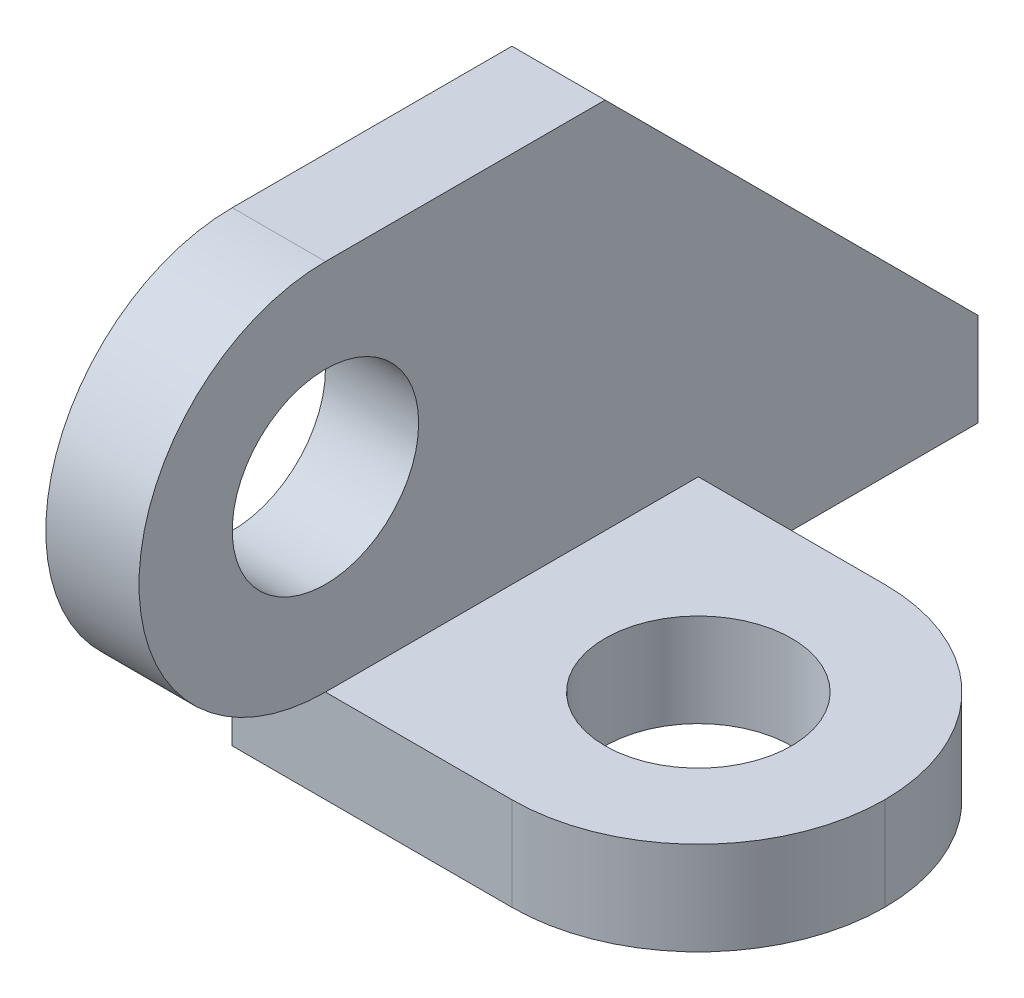
ISO-10303-21;
HEADER;
FILE_DESCRIPTION(('STEP AP214'),'2;1');
FILE_NAME('part.step','',(''),(''),'','','');
FILE_SCHEMA(('AUTOMOTIVE_DESIGN { 1 0 10303 214 1 1 1 1 }'));
ENDSEC;
DATA;
#1=APPLICATION_CONTEXT('core data for automotive mechanical design processes');
#2=APPLICATION_PROTOCOL_DEFINITION('international standard','automotive_design',2000,#1);
#3=PRODUCT_CONTEXT('',#1,'mechanical');
#4=PRODUCT('Part','Part','',(#3));
#5=PRODUCT_RELATED_PRODUCT_CATEGORY('part','',(#4));
#6=PRODUCT_DEFINITION_FORMATION('','',#4);
#7=PRODUCT_DEFINITION_CONTEXT('part definition',#1,'design');
#8=PRODUCT_DEFINITION('design','',#6,#7);
#9=PRODUCT_DEFINITION_SHAPE('','',#8);
#10=(LENGTH_UNIT() NAMED_UNIT(*) SI_UNIT(.MILLI.,.METRE.));
#11=(NAMED_UNIT(*) PLANE_ANGLE_UNIT() SI_UNIT($,.RADIAN.));
#12=(NAMED_UNIT(*) SI_UNIT($,.STERADIAN.) SOLID_ANGLE_UNIT());
#13=UNCERTAINTY_MEASURE_WITH_UNIT(LENGTH_MEASURE(1.E-05),#10,'distance_accuracy_value','');
#14=(GEOMETRIC_REPRESENTATION_CONTEXT(3) GLOBAL_UNCERTAINTY_ASSIGNED_CONTEXT((#13)) GLOBAL_UNIT_ASSIGNED_CONTEXT((#10,
#11,#12)) REPRESENTATION_CONTEXT('',''));
#15=CARTESIAN_POINT('',(0.,0.,0.));
#16=DIRECTION('',(0.,0.,1.));
#17=DIRECTION('',(1.,0.,0.));
#18=AXIS2_PLACEMENT_3D('',#15,#16,#17);
#19=CARTESIAN_POINT('',(10.,20.,0.));
#20=DIRECTION('',(0.,-1.,0.));
#21=DIRECTION('',(0.,0.,-1.));
#22=AXIS2_PLACEMENT_3D('',#19,#20,#21);
#23=PLANE('',#22);
#24=DIRECTION('',(0.,0.,1.));
#25=VECTOR('',#24,1.);
#26=CARTESIAN_POINT('',(0.,20.,0.));
#27=LINE('',#26,#25);
#28=CARTESIAN_POINT('',(0.,20.,-30.));
#29=VERTEX_POINT('',#28);
#30=CARTESIAN_POINT('',(0.,20.,0.));
#31=VERTEX_POINT('',#30);
#32=EDGE_CURVE('E168',#29,#31,#27,.T.);
#33=ORIENTED_EDGE('',*,*,#32,.T.);
#34=DIRECTION('',(-1.,0.,0.));
#35=VECTOR('',#34,1.);
#36=CARTESIAN_POINT('',(10.,20.,0.));
#37=LINE('',#36,#35);
#38=CARTESIAN_POINT('',(10.,20.,0.));
#39=VERTEX_POINT('',#38);
#40=EDGE_CURVE('E182',#39,#31,#37,.T.);
#41=ORIENTED_EDGE('',*,*,#40,.F.);
#42=DIRECTION('',(0.,0.,1.));
#43=VECTOR('',#42,1.);
#44=CARTESIAN_POINT('',(10.,20.,0.));
#45=LINE('',#44,#43);
#46=CARTESIAN_POINT('',(10.,20.,-30.));
#47=VERTEX_POINT('',#46);
#48=EDGE_CURVE('E147',#47,#39,#45,.T.);
#49=ORIENTED_EDGE('',*,*,#48,.F.);
#50=DIRECTION('',(-1.,0.,0.));
#51=VECTOR('',#50,1.);
#52=CARTESIAN_POINT('',(10.,20.,-30.));
#53=LINE('',#52,#51);
#54=EDGE_CURVE('E165',#47,#29,#53,.T.);
#55=ORIENTED_EDGE('',*,*,#54,.T.);
#56=EDGE_LOOP('',(#33,#41,#49,#55));
#57=FACE_BOUND('',#56,.T.);
#58=ADVANCED_FACE('F37',(#57),#23,.F.);
#59=CARTESIAN_POINT('',(10.,0.,0.));
#60=DIRECTION('',(-1.,0.,0.));
#61=DIRECTION('',(0.,0.,1.));
#62=AXIS2_PLACEMENT_3D('',#59,#60,#61);
#63=CYLINDRICAL_SURFACE('',#62,20.);
#64=CARTESIAN_POINT('',(0.,0.,0.));
#65=DIRECTION('',(1.,0.,0.));
#66=DIRECTION('',(0.,0.,-1.));
#67=AXIS2_PLACEMENT_3D('',#64,#65,#66);
#68=CIRCLE('',#67,20.);
#69=CARTESIAN_POINT('',(0.,-20.,0.));
#70=VERTEX_POINT('',#69);
#71=EDGE_CURVE('E126',#70,#31,#68,.F.);
#72=ORIENTED_EDGE('',*,*,#71,.F.);
#73=DIRECTION('',(-1.,0.,0.));
#74=VECTOR('',#73,1.);
#75=CARTESIAN_POINT('',(10.,-20.,0.));
#76=LINE('',#75,#74);
#77=CARTESIAN_POINT('',(10.,-20.,0.));
#78=VERTEX_POINT('',#77);
#79=EDGE_CURVE('E130',#78,#70,#76,.T.);
#80=ORIENTED_EDGE('',*,*,#79,.F.);
#81=CARTESIAN_POINT('',(10.,0.,0.));
#82=DIRECTION('',(1.,0.,0.));
#83=DIRECTION('',(0.,0.,-1.));
#84=AXIS2_PLACEMENT_3D('',#81,#82,#83);
#85=CIRCLE('',#84,20.);
#86=EDGE_CURVE('E150',#78,#39,#85,.F.);
#87=ORIENTED_EDGE('',*,*,#86,.T.);
#88=ORIENTED_EDGE('',*,*,#40,.T.);
#89=EDGE_LOOP('',(#72,#80,#87,#88));
#90=FACE_BOUND('',#89,.T.);
#91=ADVANCED_FACE('F210',(#90),#63,.T.);
#92=CARTESIAN_POINT('',(10.,-30.,0.));
#93=DIRECTION('',(0.,1.,0.));
#94=DIRECTION('',(0.,0.,1.));
#95=AXIS2_PLACEMENT_3D('',#92,#93,#94);
#96=PLANE('',#95);
#97=CARTESIAN_POINT('',(30.,-30.,-20.));
#98=DIRECTION('',(0.,1.,0.));
#99=DIRECTION('',(0.,0.,1.));
#100=AXIS2_PLACEMENT_3D('',#97,#98,#99);
#101=CIRCLE('',#100,10.);
#102=CARTESIAN_POINT('',(30.,-30.,-9.99999999999999));
#103=VERTEX_POINT('',#102);
#104=EDGE_CURVE('E135',#103,#103,#101,.T.);
#105=ORIENTED_EDGE('',*,*,#104,.T.);
#106=EDGE_LOOP('',(#105));
#107=FACE_BOUND('',#106,.T.);
#108=DIRECTION('',(-1.,0.,0.));
#109=VECTOR('',#108,1.);
#110=CARTESIAN_POINT('',(50.,-30.,-40.));
#111=LINE('',#110,#109);
#112=CARTESIAN_POINT('',(30.,-30.,-40.));
#113=VERTEX_POINT('',#112);
#114=CARTESIAN_POINT('',(10.,-30.,-40.));
#115=VERTEX_POINT('',#114);
#116=EDGE_CURVE('E115',#113,#115,#111,.T.);
#117=ORIENTED_EDGE('',*,*,#116,.F.);
#118=CARTESIAN_POINT('',(30.,-30.,-20.));
#119=DIRECTION('',(0.,1.,0.));
#120=DIRECTION('',(0.,0.,1.));
#121=AXIS2_PLACEMENT_3D('',#118,#119,#120);
#122=CIRCLE('',#121,20.);
#123=CARTESIAN_POINT('',(50.,-30.,-20.));
#124=VERTEX_POINT('',#123);
#125=EDGE_CURVE('E46',#113,#124,#122,.F.);
#126=ORIENTED_EDGE('',*,*,#125,.T.);
#127=CARTESIAN_POINT('',(30.,-30.,-20.));
#128=DIRECTION('',(0.,1.,0.));
#129=DIRECTION('',(0.,0.,1.));
#130=AXIS2_PLACEMENT_3D('',#127,#128,#129);
#131=CIRCLE('',#130,20.);
#132=CARTESIAN_POINT('',(30.,-30.,0.));
#133=VERTEX_POINT('',#132);
#134=EDGE_CURVE('E53',#124,#133,#131,.F.);
#135=ORIENTED_EDGE('',*,*,#134,.T.);
#136=DIRECTION('',(-1.,0.,0.));
#137=VECTOR('',#136,1.);
#138=CARTESIAN_POINT('',(50.,-30.,0.));
#139=LINE('',#138,#137);
#140=CARTESIAN_POINT('',(0.,-30.,0.));
#141=VERTEX_POINT('',#140);
#142=EDGE_CURVE('E105',#133,#141,#139,.T.);
#143=ORIENTED_EDGE('',*,*,#142,.T.);
#144=DIRECTION('',(0.,0.,-1.));
#145=VECTOR('',#144,1.);
#146=CARTESIAN_POINT('',(0.,-30.,0.));
#147=LINE('',#146,#145);
#148=CARTESIAN_POINT('',(0.,-30.,-70.));
#149=VERTEX_POINT('',#148);
#150=EDGE_CURVE('E109',#141,#149,#147,.T.);
#151=ORIENTED_EDGE('',*,*,#150,.T.);
#152=DIRECTION('',(-1.,0.,0.));
#153=VECTOR('',#152,1.);
#154=CARTESIAN_POINT('',(10.,-30.,-70.));
#155=LINE('',#154,#153);
#156=CARTESIAN_POINT('',(10.,-30.,-70.));
#157=VERTEX_POINT('',#156);
#158=EDGE_CURVE('E179',#157,#149,#155,.T.);
#159=ORIENTED_EDGE('',*,*,#158,.F.);
#160=DIRECTION('',(0.,0.,-1.));
#161=VECTOR('',#160,1.);
#162=CARTESIAN_POINT('',(10.,-30.,0.));
#163=LINE('',#162,#161);
#164=EDGE_CURVE('E159',#115,#157,#163,.T.);
#165=ORIENTED_EDGE('',*,*,#164,.F.);
#166=EDGE_LOOP('',(#117,#126,#135,#143,#151,#159,#165));
#167=FACE_BOUND('',#166,.T.);
#168=ADVANCED_FACE('F107',(#107,#167),#96,.F.);
#169=CARTESIAN_POINT('',(10.,0.,-70.));
#170=DIRECTION('',(0.,0.,1.));
#171=DIRECTION('',(1.,0.,0.));
#172=AXIS2_PLACEMENT_3D('',#169,#170,#171);
#173=PLANE('',#172);
#174=DIRECTION('',(0.,1.,0.));
#175=VECTOR('',#174,1.);
#176=CARTESIAN_POINT('',(0.,0.,-70.));
#177=LINE('',#176,#175);
#178=CARTESIAN_POINT('',(0.,-20.,-70.));
#179=VERTEX_POINT('',#178);
#180=EDGE_CURVE('E125',#149,#179,#177,.T.);
#181=ORIENTED_EDGE('',*,*,#180,.T.);
#182=DIRECTION('',(-1.,0.,0.));
#183=VECTOR('',#182,1.);
#184=CARTESIAN_POINT('',(10.,-20.,-70.));
#185=LINE('',#184,#183);
#186=CARTESIAN_POINT('',(10.,-20.,-70.));
#187=VERTEX_POINT('',#186);
#188=EDGE_CURVE('E176',#187,#179,#185,.T.);
#189=ORIENTED_EDGE('',*,*,#188,.F.);
#190=DIRECTION('',(0.,1.,0.));
#191=VECTOR('',#190,1.);
#192=CARTESIAN_POINT('',(10.,0.,-70.));
#193=LINE('',#192,#191);
#194=EDGE_CURVE('E161',#157,#187,#193,.T.);
#195=ORIENTED_EDGE('',*,*,#194,.F.);
#196=ORIENTED_EDGE('',*,*,#158,.T.);
#197=EDGE_LOOP('',(#181,#189,#195,#196));
#198=FACE_BOUND('',#197,.T.);
#199=ADVANCED_FACE('F220',(#198),#173,.F.);
#200=CARTESIAN_POINT('',(10.,0.,0.));
#201=DIRECTION('',(-1.,0.,0.));
#202=DIRECTION('',(0.,0.,1.));
#203=AXIS2_PLACEMENT_3D('',#200,#201,#202);
#204=CYLINDRICAL_SURFACE('',#203,10.);
#205=CARTESIAN_POINT('',(10.,0.,0.));
#206=DIRECTION('',(1.,0.,0.));
#207=DIRECTION('',(0.,0.,-1.));
#208=AXIS2_PLACEMENT_3D('',#205,#206,#207);
#209=CIRCLE('',#208,10.);
#210=CARTESIAN_POINT('',(10.,0.,-10.));
#211=VERTEX_POINT('',#210);
#212=EDGE_CURVE('E144',#211,#211,#209,.T.);
#213=ORIENTED_EDGE('',*,*,#212,.T.);
#214=EDGE_LOOP('',(#213));
#215=FACE_BOUND('',#214,.T.);
#216=CARTESIAN_POINT('',(0.,0.,0.));
#217=DIRECTION('',(1.,0.,0.));
#218=DIRECTION('',(0.,0.,-1.));
#219=AXIS2_PLACEMENT_3D('',#216,#217,#218);
#220=CIRCLE('',#219,10.);
#221=CARTESIAN_POINT('',(0.,0.,-10.));
#222=VERTEX_POINT('',#221);
#223=EDGE_CURVE('E143',#222,#222,#220,.T.);
#224=ORIENTED_EDGE('',*,*,#223,.F.);
#225=EDGE_LOOP('',(#224));
#226=FACE_BOUND('',#225,.T.);
#227=ADVANCED_FACE('F222',(#215,#226),#204,.F.);
#228=CARTESIAN_POINT('',(10.,25.,-25.));
#229=DIRECTION('',(0.,-0.707106781186548,0.707106781186548));
#230=DIRECTION('',(0.,-0.707106781186548,-0.707106781186548));
#231=AXIS2_PLACEMENT_3D('',#228,#229,#230);
#232=PLANE('',#231);
#233=DIRECTION('',(0.,0.707106781186548,0.707106781186548));
#234=VECTOR('',#233,1.);
#235=CARTESIAN_POINT('',(0.,25.,-25.));
#236=LINE('',#235,#234);
#237=EDGE_CURVE('E148',#179,#29,#236,.T.);
#238=ORIENTED_EDGE('',*,*,#237,.T.);
#239=ORIENTED_EDGE('',*,*,#54,.F.);
#240=DIRECTION('',(0.,0.707106781186548,0.707106781186548));
#241=VECTOR('',#240,1.);
#242=CARTESIAN_POINT('',(10.,25.,-25.));
#243=LINE('',#242,#241);
#244=EDGE_CURVE('E163',#187,#47,#243,.T.);
#245=ORIENTED_EDGE('',*,*,#244,.F.);
#246=ORIENTED_EDGE('',*,*,#188,.T.);
#247=EDGE_LOOP('',(#238,#239,#245,#246));
#248=FACE_BOUND('',#247,.T.);
#249=ADVANCED_FACE('F217',(#248),#232,.F.);
#250=CARTESIAN_POINT('',(10.,0.,0.));
#251=DIRECTION('',(1.,0.,0.));
#252=DIRECTION('',(0.,0.,-1.));
#253=AXIS2_PLACEMENT_3D('',#250,#251,#252);
#254=PLANE('',#253);
#255=ORIENTED_EDGE('',*,*,#212,.F.);
#256=EDGE_LOOP('',(#255));
#257=FACE_BOUND('',#256,.T.);
#258=ORIENTED_EDGE('',*,*,#48,.T.);
#259=ORIENTED_EDGE('',*,*,#86,.F.);
#260=DIRECTION('',(0.,0.,1.));
#261=VECTOR('',#260,1.);
#262=CARTESIAN_POINT('',(10.,-20.,0.));
#263=LINE('',#262,#261);
#264=CARTESIAN_POINT('',(10.,-20.,-40.));
#265=VERTEX_POINT('',#264);
#266=EDGE_CURVE('E153',#265,#78,#263,.T.);
#267=ORIENTED_EDGE('',*,*,#266,.F.);
#268=DIRECTION('',(0.,1.,0.));
#269=VECTOR('',#268,1.);
#270=CARTESIAN_POINT('',(10.,0.,-40.));
#271=LINE('',#270,#269);
#272=EDGE_CURVE('E156',#115,#265,#271,.T.);
#273=ORIENTED_EDGE('',*,*,#272,.F.);
#274=ORIENTED_EDGE('',*,*,#164,.T.);
#275=ORIENTED_EDGE('',*,*,#194,.T.);
#276=ORIENTED_EDGE('',*,*,#244,.T.);
#277=EDGE_LOOP('',(#258,#259,#267,#273,#274,#275,#276));
#278=FACE_BOUND('',#277,.T.);
#279=ADVANCED_FACE('F203',(#257,#278),#254,.T.);
#280=CARTESIAN_POINT('',(0.,0.,0.));
#281=DIRECTION('',(1.,0.,0.));
#282=DIRECTION('',(0.,0.,-1.));
#283=AXIS2_PLACEMENT_3D('',#280,#281,#282);
#284=PLANE('',#283);
#285=ORIENTED_EDGE('',*,*,#223,.T.);
#286=EDGE_LOOP('',(#285));
#287=FACE_BOUND('',#286,.T.);
#288=ORIENTED_EDGE('',*,*,#32,.F.);
#289=ORIENTED_EDGE('',*,*,#237,.F.);
#290=ORIENTED_EDGE('',*,*,#180,.F.);
#291=ORIENTED_EDGE('',*,*,#150,.F.);
#292=DIRECTION('',(0.,-1.,0.));
#293=VECTOR('',#292,1.);
#294=CARTESIAN_POINT('',(0.,0.,0.));
#295=LINE('',#294,#293);
#296=EDGE_CURVE('E122',#70,#141,#295,.T.);
#297=ORIENTED_EDGE('',*,*,#296,.F.);
#298=ORIENTED_EDGE('',*,*,#71,.T.);
#299=EDGE_LOOP('',(#288,#289,#290,#291,#297,#298));
#300=FACE_BOUND('',#299,.T.);
#301=ADVANCED_FACE('F120',(#287,#300),#284,.F.);
#302=CARTESIAN_POINT('',(50.,0.,-40.));
#303=DIRECTION('',(0.,0.,1.));
#304=DIRECTION('',(1.,0.,0.));
#305=AXIS2_PLACEMENT_3D('',#302,#303,#304);
#306=PLANE('',#305);
#307=DIRECTION('',(-1.,0.,0.));
#308=VECTOR('',#307,1.);
#309=CARTESIAN_POINT('',(50.,-20.,-40.));
#310=LINE('',#309,#308);
#311=CARTESIAN_POINT('',(30.,-20.,-40.));
#312=VERTEX_POINT('',#311);
#313=EDGE_CURVE('E141',#312,#265,#310,.T.);
#314=ORIENTED_EDGE('',*,*,#313,.F.);
#315=DIRECTION('',(0.,1.,0.));
#316=VECTOR('',#315,1.);
#317=CARTESIAN_POINT('',(30.,-30.,-40.));
#318=LINE('',#317,#316);
#319=EDGE_CURVE('E188',#312,#113,#318,.F.);
#320=ORIENTED_EDGE('',*,*,#319,.T.);
#321=ORIENTED_EDGE('',*,*,#116,.T.);
#322=ORIENTED_EDGE('',*,*,#272,.T.);
#323=EDGE_LOOP('',(#314,#320,#321,#322));
#324=FACE_BOUND('',#323,.T.);
#325=ADVANCED_FACE('F195',(#324),#306,.F.);
#326=CARTESIAN_POINT('',(50.,-20.,0.));
#327=DIRECTION('',(0.,-1.,0.));
#328=DIRECTION('',(0.,0.,-1.));
#329=AXIS2_PLACEMENT_3D('',#326,#327,#328);
#330=PLANE('',#329);
#331=CARTESIAN_POINT('',(30.,-20.,-20.));
#332=DIRECTION('',(0.,1.,0.));
#333=DIRECTION('',(0.,0.,1.));
#334=AXIS2_PLACEMENT_3D('',#331,#332,#333);
#335=CIRCLE('',#334,10.);
#336=CARTESIAN_POINT('',(30.,-20.,-9.99999999999999));
#337=VERTEX_POINT('',#336);
#338=EDGE_CURVE('E137',#337,#337,#335,.T.);
#339=ORIENTED_EDGE('',*,*,#338,.F.);
#340=EDGE_LOOP('',(#339));
#341=FACE_BOUND('',#340,.T.);
#342=CARTESIAN_POINT('',(30.,-20.,-20.));
#343=DIRECTION('',(0.,-1.,0.));
#344=DIRECTION('',(0.,0.,-1.));
#345=AXIS2_PLACEMENT_3D('',#342,#343,#344);
#346=CIRCLE('',#345,20.);
#347=CARTESIAN_POINT('',(30.,-20.,0.));
#348=VERTEX_POINT('',#347);
#349=CARTESIAN_POINT('',(50.,-20.,-20.));
#350=VERTEX_POINT('',#349);
#351=EDGE_CURVE('E184',#348,#350,#346,.F.);
#352=ORIENTED_EDGE('',*,*,#351,.T.);
#353=CARTESIAN_POINT('',(30.,-20.,-20.));
#354=DIRECTION('',(0.,-1.,0.));
#355=DIRECTION('',(0.,0.,-1.));
#356=AXIS2_PLACEMENT_3D('',#353,#354,#355);
#357=CIRCLE('',#356,20.);
#358=EDGE_CURVE('E186',#350,#312,#357,.F.);
#359=ORIENTED_EDGE('',*,*,#358,.T.);
#360=ORIENTED_EDGE('',*,*,#313,.T.);
#361=ORIENTED_EDGE('',*,*,#266,.T.);
#362=DIRECTION('',(-1.,0.,0.));
#363=VECTOR('',#362,1.);
#364=CARTESIAN_POINT('',(50.,-20.,0.));
#365=LINE('',#364,#363);
#366=EDGE_CURVE('E114',#348,#78,#365,.T.);
#367=ORIENTED_EDGE('',*,*,#366,.F.);
#368=EDGE_LOOP('',(#352,#359,#360,#361,#367));
#369=FACE_BOUND('',#368,.T.);
#370=ADVANCED_FACE('F207',(#341,#369),#330,.F.);
#371=CARTESIAN_POINT('',(50.,0.,0.));
#372=DIRECTION('',(0.,0.,-1.));
#373=DIRECTION('',(0.,1.,0.));
#374=AXIS2_PLACEMENT_3D('',#371,#372,#373);
#375=PLANE('',#374);
#376=ORIENTED_EDGE('',*,*,#142,.F.);
#377=DIRECTION('',(0.,-1.,0.));
#378=VECTOR('',#377,1.);
#379=CARTESIAN_POINT('',(30.,-20.,0.));
#380=LINE('',#379,#378);
#381=EDGE_CURVE('E11',#133,#348,#380,.F.);
#382=ORIENTED_EDGE('',*,*,#381,.T.);
#383=ORIENTED_EDGE('',*,*,#366,.T.);
#384=ORIENTED_EDGE('',*,*,#79,.T.);
#385=ORIENTED_EDGE('',*,*,#296,.T.);
#386=EDGE_LOOP('',(#376,#382,#383,#384,#385));
#387=FACE_BOUND('',#386,.T.);
#388=ADVANCED_FACE('F128',(#387),#375,.F.);
#389=CARTESIAN_POINT('',(30.,0.,-20.));
#390=DIRECTION('',(0.,1.,0.));
#391=DIRECTION('',(0.,0.,1.));
#392=AXIS2_PLACEMENT_3D('',#389,#390,#391);
#393=CYLINDRICAL_SURFACE('',#392,20.);
#394=ORIENTED_EDGE('',*,*,#381,.F.);
#395=ORIENTED_EDGE('',*,*,#134,.F.);
#396=DIRECTION('',(0.,-1.,0.));
#397=VECTOR('',#396,1.);
#398=CARTESIAN_POINT('',(50.,-30.,-20.));
#399=LINE('',#398,#397);
#400=EDGE_CURVE('E41',#350,#124,#399,.T.);
#401=ORIENTED_EDGE('',*,*,#400,.F.);
#402=ORIENTED_EDGE('',*,*,#351,.F.);
#403=EDGE_LOOP('',(#394,#395,#401,#402));
#404=FACE_BOUND('',#403,.T.);
#405=ADVANCED_FACE('F39',(#404),#393,.T.);
#406=CARTESIAN_POINT('',(30.,0.,-20.));
#407=DIRECTION('',(0.,-1.,0.));
#408=DIRECTION('',(0.,0.,-1.));
#409=AXIS2_PLACEMENT_3D('',#406,#407,#408);
#410=CYLINDRICAL_SURFACE('',#409,20.);
#411=ORIENTED_EDGE('',*,*,#125,.F.);
#412=ORIENTED_EDGE('',*,*,#319,.F.);
#413=ORIENTED_EDGE('',*,*,#358,.F.);
#414=ORIENTED_EDGE('',*,*,#400,.T.);
#415=EDGE_LOOP('',(#411,#412,#413,#414));
#416=FACE_BOUND('',#415,.T.);
#417=ADVANCED_FACE('F239',(#416),#410,.T.);
#418=CARTESIAN_POINT('',(30.,-30.,-20.));
#419=DIRECTION('',(0.,1.,0.));
#420=DIRECTION('',(0.,0.,1.));
#421=AXIS2_PLACEMENT_3D('',#418,#419,#420);
#422=CYLINDRICAL_SURFACE('',#421,10.);
#423=ORIENTED_EDGE('',*,*,#104,.F.);
#424=EDGE_LOOP('',(#423));
#425=FACE_BOUND('',#424,.T.);
#426=ORIENTED_EDGE('',*,*,#338,.T.);
#427=EDGE_LOOP('',(#426));
#428=FACE_BOUND('',#427,.T.);
#429=ADVANCED_FACE('F241',(#425,#428),#422,.F.);
#430=CLOSED_SHELL('',(#58,#91,#168,#199,#227,#249,#279,#301,#325,#370,#388,#405,#417,#429));
#431=MANIFOLD_SOLID_BREP('B2',#430);
#432=ADVANCED_BREP_SHAPE_REPRESENTATION('',(#18,#431),#14);
#433=SHAPE_DEFINITION_REPRESENTATION(#9,#432);
ENDSEC;
END-ISO-10303-21;
